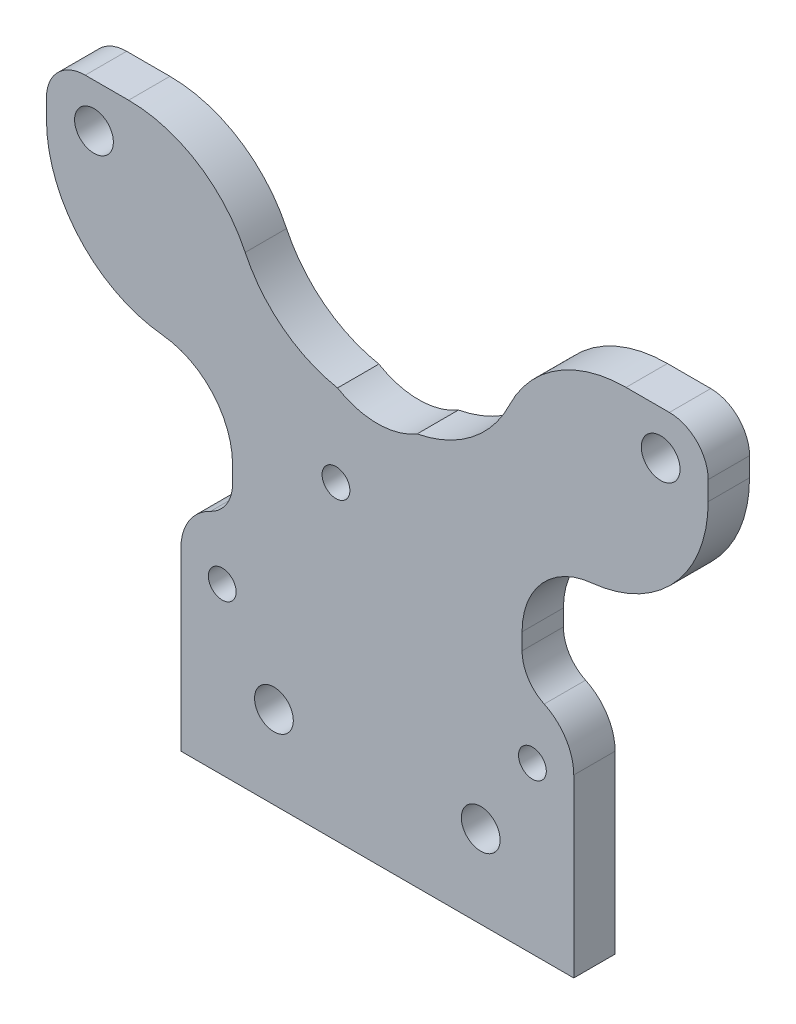
ISO-10303-21;
HEADER;
FILE_DESCRIPTION(('STEP AP214'),'2;1');
FILE_NAME('part.step','',(''),(''),'','','');
FILE_SCHEMA(('AUTOMOTIVE_DESIGN { 1 0 10303 214 1 1 1 1 }'));
ENDSEC;
DATA;
#1=APPLICATION_CONTEXT('core data for automotive mechanical design processes');
#2=APPLICATION_PROTOCOL_DEFINITION('international standard','automotive_design',2000,#1);
#3=PRODUCT_CONTEXT('',#1,'mechanical');
#4=PRODUCT('Part','Part','',(#3));
#5=PRODUCT_RELATED_PRODUCT_CATEGORY('part','',(#4));
#6=PRODUCT_DEFINITION_FORMATION('','',#4);
#7=PRODUCT_DEFINITION_CONTEXT('part definition',#1,'design');
#8=PRODUCT_DEFINITION('design','',#6,#7);
#9=PRODUCT_DEFINITION_SHAPE('','',#8);
#10=(LENGTH_UNIT() NAMED_UNIT(*) SI_UNIT(.MILLI.,.METRE.));
#11=(NAMED_UNIT(*) PLANE_ANGLE_UNIT() SI_UNIT($,.RADIAN.));
#12=(NAMED_UNIT(*) SI_UNIT($,.STERADIAN.) SOLID_ANGLE_UNIT());
#13=UNCERTAINTY_MEASURE_WITH_UNIT(LENGTH_MEASURE(1.E-05),#10,'distance_accuracy_value','');
#14=(GEOMETRIC_REPRESENTATION_CONTEXT(3) GLOBAL_UNCERTAINTY_ASSIGNED_CONTEXT((#13)) GLOBAL_UNIT_ASSIGNED_CONTEXT((#10,
#11,#12)) REPRESENTATION_CONTEXT('',''));
#15=CARTESIAN_POINT('',(0.,0.,0.));
#16=DIRECTION('',(0.,0.,1.));
#17=DIRECTION('',(1.,0.,0.));
#18=AXIS2_PLACEMENT_3D('',#15,#16,#17);
#19=CARTESIAN_POINT('',(0.,17.6,0.));
#20=DIRECTION('',(1.,0.,0.));
#21=DIRECTION('',(0.,0.,-1.));
#22=AXIS2_PLACEMENT_3D('',#19,#20,#21);
#23=PLANE('',#22);
#24=DIRECTION('',(0.,-1.,0.));
#25=VECTOR('',#24,1.);
#26=CARTESIAN_POINT('',(0.,17.6,3.2));
#27=LINE('',#26,#25);
#28=CARTESIAN_POINT('',(0.,13.6,3.2));
#29=VERTEX_POINT('',#28);
#30=CARTESIAN_POINT('',(0.,0.,3.2));
#31=VERTEX_POINT('',#30);
#32=EDGE_CURVE('E228',#29,#31,#27,.T.);
#33=ORIENTED_EDGE('',*,*,#32,.F.);
#34=DIRECTION('',(0.,0.,1.));
#35=VECTOR('',#34,1.);
#36=CARTESIAN_POINT('',(0.,13.6,0.));
#37=LINE('',#36,#35);
#38=CARTESIAN_POINT('',(0.,13.6,0.));
#39=VERTEX_POINT('',#38);
#40=EDGE_CURVE('E332',#29,#39,#37,.F.);
#41=ORIENTED_EDGE('',*,*,#40,.T.);
#42=DIRECTION('',(0.,-1.,0.));
#43=VECTOR('',#42,1.);
#44=CARTESIAN_POINT('',(0.,17.6,0.));
#45=LINE('',#44,#43);
#46=CARTESIAN_POINT('',(0.,0.,0.));
#47=VERTEX_POINT('',#46);
#48=EDGE_CURVE('E314',#39,#47,#45,.T.);
#49=ORIENTED_EDGE('',*,*,#48,.T.);
#50=DIRECTION('',(0.,0.,1.));
#51=VECTOR('',#50,1.);
#52=CARTESIAN_POINT('',(0.,0.,0.));
#53=LINE('',#52,#51);
#54=EDGE_CURVE('E302',#47,#31,#53,.T.);
#55=ORIENTED_EDGE('',*,*,#54,.T.);
#56=EDGE_LOOP('',(#33,#41,#49,#55));
#57=FACE_BOUND('',#56,.T.);
#58=ADVANCED_FACE('F45',(#57),#23,.F.);
#59=CARTESIAN_POINT('',(0.,17.6,3.2));
#60=DIRECTION('',(0.,0.,-1.));
#61=DIRECTION('',(-1.,0.,0.));
#62=AXIS2_PLACEMENT_3D('',#59,#60,#61);
#63=PLANE('',#62);
#64=CARTESIAN_POINT('',(37.125,38.2,3.2));
#65=DIRECTION('',(0.,0.,1.));
#66=DIRECTION('',(1.,0.,0.));
#67=AXIS2_PLACEMENT_3D('',#64,#65,#66);
#68=CIRCLE('',#67,1.5);
#69=CARTESIAN_POINT('',(38.625,38.2,3.2));
#70=VERTEX_POINT('',#69);
#71=EDGE_CURVE('E234',#70,#70,#68,.T.);
#72=ORIENTED_EDGE('',*,*,#71,.F.);
#73=EDGE_LOOP('',(#72));
#74=FACE_BOUND('',#73,.T.);
#75=CARTESIAN_POINT('',(-6.725,38.2,3.2));
#76=DIRECTION('',(0.,0.,1.));
#77=DIRECTION('',(1.,0.,0.));
#78=AXIS2_PLACEMENT_3D('',#75,#76,#77);
#79=CIRCLE('',#78,1.5);
#80=CARTESIAN_POINT('',(-5.225,38.2,3.2));
#81=VERTEX_POINT('',#80);
#82=EDGE_CURVE('E240',#81,#81,#79,.T.);
#83=ORIENTED_EDGE('',*,*,#82,.F.);
#84=EDGE_LOOP('',(#83));
#85=FACE_BOUND('',#84,.T.);
#86=CARTESIAN_POINT('',(12.,24.,3.2));
#87=DIRECTION('',(0.,0.,1.));
#88=DIRECTION('',(1.,0.,0.));
#89=AXIS2_PLACEMENT_3D('',#86,#87,#88);
#90=CIRCLE('',#89,1.075);
#91=CARTESIAN_POINT('',(13.075,24.,3.2));
#92=VERTEX_POINT('',#91);
#93=EDGE_CURVE('E265',#92,#92,#90,.T.);
#94=ORIENTED_EDGE('',*,*,#93,.F.);
#95=EDGE_LOOP('',(#94));
#96=FACE_BOUND('',#95,.T.);
#97=CARTESIAN_POINT('',(3.2,12.8,3.2));
#98=DIRECTION('',(0.,0.,-1.));
#99=DIRECTION('',(-1.,0.,0.));
#100=AXIS2_PLACEMENT_3D('',#97,#98,#99);
#101=CIRCLE('',#100,1.075);
#102=CARTESIAN_POINT('',(2.125,12.8,3.2));
#103=VERTEX_POINT('',#102);
#104=EDGE_CURVE('E285',#103,#103,#101,.T.);
#105=ORIENTED_EDGE('',*,*,#104,.T.);
#106=EDGE_LOOP('',(#105));
#107=FACE_BOUND('',#106,.T.);
#108=CARTESIAN_POINT('',(27.2,12.8,3.2));
#109=DIRECTION('',(0.,0.,-1.));
#110=DIRECTION('',(-1.,0.,0.));
#111=AXIS2_PLACEMENT_3D('',#108,#109,#110);
#112=CIRCLE('',#111,1.075);
#113=CARTESIAN_POINT('',(26.125,12.8,3.2));
#114=VERTEX_POINT('',#113);
#115=EDGE_CURVE('E291',#114,#114,#112,.T.);
#116=ORIENTED_EDGE('',*,*,#115,.T.);
#117=EDGE_LOOP('',(#116));
#118=FACE_BOUND('',#117,.T.);
#119=CARTESIAN_POINT('',(7.2,6.4,3.2));
#120=DIRECTION('',(0.,0.,1.));
#121=DIRECTION('',(1.,0.,0.));
#122=AXIS2_PLACEMENT_3D('',#119,#120,#121);
#123=CIRCLE('',#122,1.5);
#124=CARTESIAN_POINT('',(8.70000000000001,6.4,3.2));
#125=VERTEX_POINT('',#124);
#126=EDGE_CURVE('E294',#125,#125,#123,.T.);
#127=ORIENTED_EDGE('',*,*,#126,.F.);
#128=EDGE_LOOP('',(#127));
#129=FACE_BOUND('',#128,.T.);
#130=CARTESIAN_POINT('',(23.2,6.4,3.2));
#131=DIRECTION('',(0.,0.,1.));
#132=DIRECTION('',(1.,0.,0.));
#133=AXIS2_PLACEMENT_3D('',#130,#131,#132);
#134=CIRCLE('',#133,1.5);
#135=CARTESIAN_POINT('',(24.7,6.4,3.2));
#136=VERTEX_POINT('',#135);
#137=EDGE_CURVE('E298',#136,#136,#134,.T.);
#138=ORIENTED_EDGE('',*,*,#137,.F.);
#139=EDGE_LOOP('',(#138));
#140=FACE_BOUND('',#139,.T.);
#141=DIRECTION('',(-1.,0.,0.));
#142=VECTOR('',#141,1.);
#143=CARTESIAN_POINT('',(26.4,41.6,3.2));
#144=LINE('',#143,#142);
#145=CARTESIAN_POINT('',(37.8,41.6,3.2));
#146=VERTEX_POINT('',#145);
#147=CARTESIAN_POINT('',(34.4461267620821,41.6,3.2));
#148=VERTEX_POINT('',#147);
#149=EDGE_CURVE('E253',#146,#148,#144,.T.);
#150=ORIENTED_EDGE('',*,*,#149,.T.);
#151=CARTESIAN_POINT('',(34.4461267620821,31.6,3.2));
#152=DIRECTION('',(0.,0.,-1.));
#153=DIRECTION('',(-1.,0.,0.));
#154=AXIS2_PLACEMENT_3D('',#151,#152,#153);
#155=CIRCLE('',#154,10.);
#156=CARTESIAN_POINT('',(25.4230633810411,35.9109543284191,3.2));
#157=VERTEX_POINT('',#156);
#158=EDGE_CURVE('E404',#148,#157,#155,.F.);
#159=ORIENTED_EDGE('',*,*,#158,.T.);
#160=CARTESIAN_POINT('',(16.4,40.2219086568383,3.2));
#161=DIRECTION('',(0.,0.,-1.));
#162=DIRECTION('',(-1.,0.,0.));
#163=AXIS2_PLACEMENT_3D('',#160,#161,#162);
#164=CIRCLE('',#163,10.);
#165=CARTESIAN_POINT('',(18.2788587857328,30.4,3.2));
#166=VERTEX_POINT('',#165);
#167=EDGE_CURVE('E216',#157,#166,#164,.T.);
#168=ORIENTED_EDGE('',*,*,#167,.T.);
#169=CARTESIAN_POINT('',(15.2,35.5498183052916,3.2));
#170=DIRECTION('',(0.,0.,1.));
#171=DIRECTION('',(1.,0.,0.));
#172=AXIS2_PLACEMENT_3D('',#169,#170,#171);
#173=CIRCLE('',#172,6.);
#174=CARTESIAN_POINT('',(12.1211412142672,30.4,3.2));
#175=VERTEX_POINT('',#174);
#176=EDGE_CURVE('E223',#175,#166,#173,.T.);
#177=ORIENTED_EDGE('',*,*,#176,.F.);
#178=CARTESIAN_POINT('',(14.,40.2219086568383,3.2));
#179=DIRECTION('',(0.,0.,-1.));
#180=DIRECTION('',(-1.,0.,0.));
#181=AXIS2_PLACEMENT_3D('',#178,#179,#180);
#182=CIRCLE('',#181,10.);
#183=CARTESIAN_POINT('',(4.97693661895893,35.9109543284191,3.2));
#184=VERTEX_POINT('',#183);
#185=EDGE_CURVE('E206',#175,#184,#182,.T.);
#186=ORIENTED_EDGE('',*,*,#185,.T.);
#187=CARTESIAN_POINT('',(-4.04612676208213,31.6,3.2));
#188=DIRECTION('',(0.,0.,-1.));
#189=DIRECTION('',(-1.,0.,0.));
#190=AXIS2_PLACEMENT_3D('',#187,#188,#189);
#191=CIRCLE('',#190,10.);
#192=CARTESIAN_POINT('',(-4.04612676208213,41.6,3.2));
#193=VERTEX_POINT('',#192);
#194=EDGE_CURVE('E402',#184,#193,#191,.F.);
#195=ORIENTED_EDGE('',*,*,#194,.T.);
#196=DIRECTION('',(-1.,0.,0.));
#197=VECTOR('',#196,1.);
#198=CARTESIAN_POINT('',(4.,41.6,3.2));
#199=LINE('',#198,#197);
#200=CARTESIAN_POINT('',(-7.4,41.6,3.2));
#201=VERTEX_POINT('',#200);
#202=EDGE_CURVE('E256',#193,#201,#199,.T.);
#203=ORIENTED_EDGE('',*,*,#202,.T.);
#204=CARTESIAN_POINT('',(-7.4,38.6,3.2));
#205=DIRECTION('',(0.,0.,-1.));
#206=DIRECTION('',(-1.,0.,0.));
#207=AXIS2_PLACEMENT_3D('',#204,#205,#206);
#208=CIRCLE('',#207,3.);
#209=CARTESIAN_POINT('',(-10.4,38.6,3.2));
#210=VERTEX_POINT('',#209);
#211=EDGE_CURVE('E383',#201,#210,#208,.F.);
#212=ORIENTED_EDGE('',*,*,#211,.T.);
#213=DIRECTION('',(0.,-1.,0.));
#214=VECTOR('',#213,1.);
#215=CARTESIAN_POINT('',(-10.4,27.2,3.2));
#216=LINE('',#215,#214);
#217=CARTESIAN_POINT('',(-10.4,37.1197989937059,3.2));
#218=VERTEX_POINT('',#217);
#219=EDGE_CURVE('E263',#210,#218,#216,.T.);
#220=ORIENTED_EDGE('',*,*,#219,.T.);
#221=CARTESIAN_POINT('',(-0.399999999999999,37.1197989937059,3.2));
#222=DIRECTION('',(0.,0.,-1.));
#223=DIRECTION('',(-1.,0.,0.));
#224=AXIS2_PLACEMENT_3D('',#221,#222,#223);
#225=CIRCLE('',#224,10.);
#226=CARTESIAN_POINT('',(-1.4,27.1699246226397,3.2));
#227=VERTEX_POINT('',#226);
#228=EDGE_CURVE('E364',#218,#227,#225,.F.);
#229=ORIENTED_EDGE('',*,*,#228,.T.);
#230=CARTESIAN_POINT('',(-2.,21.2,3.2));
#231=DIRECTION('',(0.,0.,-1.));
#232=DIRECTION('',(-1.,0.,0.));
#233=AXIS2_PLACEMENT_3D('',#230,#231,#232);
#234=CIRCLE('',#233,6.);
#235=CARTESIAN_POINT('',(4.,21.2,3.2));
#236=VERTEX_POINT('',#235);
#237=EDGE_CURVE('E356',#227,#236,#234,.T.);
#238=ORIENTED_EDGE('',*,*,#237,.T.);
#239=DIRECTION('',(0.,-1.,0.));
#240=VECTOR('',#239,1.);
#241=CARTESIAN_POINT('',(4.,30.4,3.2));
#242=LINE('',#241,#240);
#243=CARTESIAN_POINT('',(4.,19.9245553203368,3.2));
#244=VERTEX_POINT('',#243);
#245=EDGE_CURVE('E279',#236,#244,#242,.T.);
#246=ORIENTED_EDGE('',*,*,#245,.T.);
#247=CARTESIAN_POINT('',(1.,19.9245553203368,3.2));
#248=DIRECTION('',(0.,0.,-1.));
#249=DIRECTION('',(-1.,0.,0.));
#250=AXIS2_PLACEMENT_3D('',#247,#248,#249);
#251=CIRCLE('',#250,3.);
#252=CARTESIAN_POINT('',(2.28571428571429,17.214031611621,3.2));
#253=VERTEX_POINT('',#252);
#254=EDGE_CURVE('E424',#244,#253,#251,.T.);
#255=ORIENTED_EDGE('',*,*,#254,.T.);
#256=CARTESIAN_POINT('',(4.,13.6,3.2));
#257=DIRECTION('',(0.,0.,-1.));
#258=DIRECTION('',(-1.,0.,0.));
#259=AXIS2_PLACEMENT_3D('',#256,#257,#258);
#260=CIRCLE('',#259,4.);
#261=EDGE_CURVE('E330',#253,#29,#260,.F.);
#262=ORIENTED_EDGE('',*,*,#261,.T.);
#263=ORIENTED_EDGE('',*,*,#32,.T.);
#264=DIRECTION('',(1.,0.,0.));
#265=VECTOR('',#264,1.);
#266=CARTESIAN_POINT('',(0.,0.,3.2));
#267=LINE('',#266,#265);
#268=CARTESIAN_POINT('',(30.4,0.,3.2));
#269=VERTEX_POINT('',#268);
#270=EDGE_CURVE('E305',#31,#269,#267,.T.);
#271=ORIENTED_EDGE('',*,*,#270,.T.);
#272=DIRECTION('',(0.,-1.,0.));
#273=VECTOR('',#272,1.);
#274=CARTESIAN_POINT('',(30.4,17.6,3.2));
#275=LINE('',#274,#273);
#276=CARTESIAN_POINT('',(30.4,13.6,3.2));
#277=VERTEX_POINT('',#276);
#278=EDGE_CURVE('E318',#277,#269,#275,.T.);
#279=ORIENTED_EDGE('',*,*,#278,.F.);
#280=CARTESIAN_POINT('',(26.4,13.6,3.2));
#281=DIRECTION('',(0.,0.,-1.));
#282=DIRECTION('',(-1.,0.,0.));
#283=AXIS2_PLACEMENT_3D('',#280,#281,#282);
#284=CIRCLE('',#283,4.);
#285=CARTESIAN_POINT('',(28.1142857142857,17.214031611621,3.2));
#286=VERTEX_POINT('',#285);
#287=EDGE_CURVE('E328',#277,#286,#284,.F.);
#288=ORIENTED_EDGE('',*,*,#287,.T.);
#289=CARTESIAN_POINT('',(29.4,19.9245553203368,3.2));
#290=DIRECTION('',(0.,0.,-1.));
#291=DIRECTION('',(-1.,0.,0.));
#292=AXIS2_PLACEMENT_3D('',#289,#290,#291);
#293=CIRCLE('',#292,3.);
#294=CARTESIAN_POINT('',(26.4,19.9245553203368,3.2));
#295=VERTEX_POINT('',#294);
#296=EDGE_CURVE('E13',#286,#295,#293,.T.);
#297=ORIENTED_EDGE('',*,*,#296,.T.);
#298=DIRECTION('',(0.,-1.,0.));
#299=VECTOR('',#298,1.);
#300=CARTESIAN_POINT('',(26.4,30.4,3.2));
#301=LINE('',#300,#299);
#302=CARTESIAN_POINT('',(26.4,21.2,3.2));
#303=VERTEX_POINT('',#302);
#304=EDGE_CURVE('E276',#303,#295,#301,.T.);
#305=ORIENTED_EDGE('',*,*,#304,.F.);
#306=CARTESIAN_POINT('',(32.4,21.2,3.2));
#307=DIRECTION('',(0.,0.,-1.));
#308=DIRECTION('',(-1.,0.,0.));
#309=AXIS2_PLACEMENT_3D('',#306,#307,#308);
#310=CIRCLE('',#309,6.);
#311=CARTESIAN_POINT('',(31.8,27.1699246226397,3.2));
#312=VERTEX_POINT('',#311);
#313=EDGE_CURVE('E351',#303,#312,#310,.T.);
#314=ORIENTED_EDGE('',*,*,#313,.T.);
#315=CARTESIAN_POINT('',(30.8,37.1197989937059,3.2));
#316=DIRECTION('',(0.,0.,-1.));
#317=DIRECTION('',(-1.,0.,0.));
#318=AXIS2_PLACEMENT_3D('',#315,#316,#317);
#319=CIRCLE('',#318,10.);
#320=CARTESIAN_POINT('',(40.8,37.1197989937059,3.2));
#321=VERTEX_POINT('',#320);
#322=EDGE_CURVE('E366',#312,#321,#319,.F.);
#323=ORIENTED_EDGE('',*,*,#322,.T.);
#324=DIRECTION('',(0.,1.,0.));
#325=VECTOR('',#324,1.);
#326=CARTESIAN_POINT('',(40.8,27.2,3.2));
#327=LINE('',#326,#325);
#328=CARTESIAN_POINT('',(40.8,38.6,3.2));
#329=VERTEX_POINT('',#328);
#330=EDGE_CURVE('E246',#321,#329,#327,.T.);
#331=ORIENTED_EDGE('',*,*,#330,.T.);
#332=CARTESIAN_POINT('',(37.8,38.6,3.2));
#333=DIRECTION('',(0.,0.,-1.));
#334=DIRECTION('',(-1.,0.,0.));
#335=AXIS2_PLACEMENT_3D('',#332,#333,#334);
#336=CIRCLE('',#335,3.);
#337=EDGE_CURVE('E385',#329,#146,#336,.F.);
#338=ORIENTED_EDGE('',*,*,#337,.T.);
#339=EDGE_LOOP('',(#150,#159,#168,#177,#186,#195,#203,#212,#220,#229,#238,#246,#255,#262,#263,
#271,#279,#288,#297,#305,#314,#323,#331,#338));
#340=FACE_BOUND('',#339,.T.);
#341=ADVANCED_FACE('F231',(#74,#85,#96,#107,#118,#129,#140,#340),#63,.F.);
#342=CARTESIAN_POINT('',(30.4,17.6,0.));
#343=DIRECTION('',(-1.,0.,0.));
#344=DIRECTION('',(0.,0.,1.));
#345=AXIS2_PLACEMENT_3D('',#342,#343,#344);
#346=PLANE('',#345);
#347=DIRECTION('',(0.,-1.,0.));
#348=VECTOR('',#347,1.);
#349=CARTESIAN_POINT('',(30.4,17.6,0.));
#350=LINE('',#349,#348);
#351=CARTESIAN_POINT('',(30.4,13.6,0.));
#352=VERTEX_POINT('',#351);
#353=CARTESIAN_POINT('',(30.4,0.,0.));
#354=VERTEX_POINT('',#353);
#355=EDGE_CURVE('E316',#352,#354,#350,.T.);
#356=ORIENTED_EDGE('',*,*,#355,.F.);
#357=DIRECTION('',(0.,0.,-1.));
#358=VECTOR('',#357,1.);
#359=CARTESIAN_POINT('',(30.4,13.6,3.2));
#360=LINE('',#359,#358);
#361=EDGE_CURVE('E339',#352,#277,#360,.F.);
#362=ORIENTED_EDGE('',*,*,#361,.T.);
#363=ORIENTED_EDGE('',*,*,#278,.T.);
#364=DIRECTION('',(0.,0.,-1.));
#365=VECTOR('',#364,1.);
#366=CARTESIAN_POINT('',(30.4,0.,0.));
#367=LINE('',#366,#365);
#368=EDGE_CURVE('E308',#269,#354,#367,.T.);
#369=ORIENTED_EDGE('',*,*,#368,.T.);
#370=EDGE_LOOP('',(#356,#362,#363,#369));
#371=FACE_BOUND('',#370,.T.);
#372=ADVANCED_FACE('F459',(#371),#346,.F.);
#373=CARTESIAN_POINT('',(0.,17.6,0.));
#374=DIRECTION('',(0.,0.,1.));
#375=DIRECTION('',(1.,0.,0.));
#376=AXIS2_PLACEMENT_3D('',#373,#374,#375);
#377=PLANE('',#376);
#378=CARTESIAN_POINT('',(37.125,38.2,0.));
#379=DIRECTION('',(0.,0.,1.));
#380=DIRECTION('',(1.,0.,0.));
#381=AXIS2_PLACEMENT_3D('',#378,#379,#380);
#382=CIRCLE('',#381,1.5);
#383=CARTESIAN_POINT('',(38.625,38.2,0.));
#384=VERTEX_POINT('',#383);
#385=EDGE_CURVE('E237',#384,#384,#382,.T.);
#386=ORIENTED_EDGE('',*,*,#385,.T.);
#387=EDGE_LOOP('',(#386));
#388=FACE_BOUND('',#387,.T.);
#389=CARTESIAN_POINT('',(-6.725,38.2,0.));
#390=DIRECTION('',(0.,0.,1.));
#391=DIRECTION('',(1.,0.,0.));
#392=AXIS2_PLACEMENT_3D('',#389,#390,#391);
#393=CIRCLE('',#392,1.5);
#394=CARTESIAN_POINT('',(-5.225,38.2,0.));
#395=VERTEX_POINT('',#394);
#396=EDGE_CURVE('E243',#395,#395,#393,.T.);
#397=ORIENTED_EDGE('',*,*,#396,.T.);
#398=EDGE_LOOP('',(#397));
#399=FACE_BOUND('',#398,.T.);
#400=CARTESIAN_POINT('',(12.,24.,0.));
#401=DIRECTION('',(0.,0.,1.));
#402=DIRECTION('',(1.,0.,0.));
#403=AXIS2_PLACEMENT_3D('',#400,#401,#402);
#404=CIRCLE('',#403,1.075);
#405=CARTESIAN_POINT('',(13.075,24.,0.));
#406=VERTEX_POINT('',#405);
#407=EDGE_CURVE('E270',#406,#406,#404,.T.);
#408=ORIENTED_EDGE('',*,*,#407,.T.);
#409=EDGE_LOOP('',(#408));
#410=FACE_BOUND('',#409,.T.);
#411=CARTESIAN_POINT('',(3.2,12.8,0.));
#412=DIRECTION('',(0.,0.,-1.));
#413=DIRECTION('',(-1.,0.,0.));
#414=AXIS2_PLACEMENT_3D('',#411,#412,#413);
#415=CIRCLE('',#414,1.075);
#416=CARTESIAN_POINT('',(2.125,12.8,0.));
#417=VERTEX_POINT('',#416);
#418=EDGE_CURVE('E282',#417,#417,#415,.T.);
#419=ORIENTED_EDGE('',*,*,#418,.F.);
#420=EDGE_LOOP('',(#419));
#421=FACE_BOUND('',#420,.T.);
#422=CARTESIAN_POINT('',(27.2,12.8,0.));
#423=DIRECTION('',(0.,0.,-1.));
#424=DIRECTION('',(-1.,0.,0.));
#425=AXIS2_PLACEMENT_3D('',#422,#423,#424);
#426=CIRCLE('',#425,1.075);
#427=CARTESIAN_POINT('',(26.125,12.8,0.));
#428=VERTEX_POINT('',#427);
#429=EDGE_CURVE('E288',#428,#428,#426,.T.);
#430=ORIENTED_EDGE('',*,*,#429,.F.);
#431=EDGE_LOOP('',(#430));
#432=FACE_BOUND('',#431,.T.);
#433=CARTESIAN_POINT('',(7.2,6.4,0.));
#434=DIRECTION('',(0.,0.,1.));
#435=DIRECTION('',(1.,0.,0.));
#436=AXIS2_PLACEMENT_3D('',#433,#434,#435);
#437=CIRCLE('',#436,1.5);
#438=CARTESIAN_POINT('',(8.70000000000001,6.4,0.));
#439=VERTEX_POINT('',#438);
#440=EDGE_CURVE('E297',#439,#439,#437,.T.);
#441=ORIENTED_EDGE('',*,*,#440,.T.);
#442=EDGE_LOOP('',(#441));
#443=FACE_BOUND('',#442,.T.);
#444=CARTESIAN_POINT('',(23.2,6.4,0.));
#445=DIRECTION('',(0.,0.,1.));
#446=DIRECTION('',(1.,0.,0.));
#447=AXIS2_PLACEMENT_3D('',#444,#445,#446);
#448=CIRCLE('',#447,1.5);
#449=CARTESIAN_POINT('',(24.7,6.4,0.));
#450=VERTEX_POINT('',#449);
#451=EDGE_CURVE('E301',#450,#450,#448,.T.);
#452=ORIENTED_EDGE('',*,*,#451,.T.);
#453=EDGE_LOOP('',(#452));
#454=FACE_BOUND('',#453,.T.);
#455=CARTESIAN_POINT('',(16.4,40.2219086568383,0.));
#456=DIRECTION('',(0.,0.,1.));
#457=DIRECTION('',(1.,0.,0.));
#458=AXIS2_PLACEMENT_3D('',#455,#456,#457);
#459=CIRCLE('',#458,10.);
#460=CARTESIAN_POINT('',(18.2788587857328,30.4,0.));
#461=VERTEX_POINT('',#460);
#462=CARTESIAN_POINT('',(25.4230633810411,35.9109543284191,0.));
#463=VERTEX_POINT('',#462);
#464=EDGE_CURVE('E341',#461,#463,#459,.T.);
#465=ORIENTED_EDGE('',*,*,#464,.T.);
#466=CARTESIAN_POINT('',(34.4461267620821,31.6,0.));
#467=DIRECTION('',(0.,0.,1.));
#468=DIRECTION('',(1.,0.,0.));
#469=AXIS2_PLACEMENT_3D('',#466,#467,#468);
#470=CIRCLE('',#469,10.);
#471=CARTESIAN_POINT('',(34.4461267620821,41.6,0.));
#472=VERTEX_POINT('',#471);
#473=EDGE_CURVE('E410',#463,#472,#470,.F.);
#474=ORIENTED_EDGE('',*,*,#473,.T.);
#475=DIRECTION('',(-1.,0.,0.));
#476=VECTOR('',#475,1.);
#477=CARTESIAN_POINT('',(26.4,41.6,0.));
#478=LINE('',#477,#476);
#479=CARTESIAN_POINT('',(37.8,41.6,0.));
#480=VERTEX_POINT('',#479);
#481=EDGE_CURVE('E252',#480,#472,#478,.T.);
#482=ORIENTED_EDGE('',*,*,#481,.F.);
#483=CARTESIAN_POINT('',(37.8,38.6,0.));
#484=DIRECTION('',(0.,0.,1.));
#485=DIRECTION('',(1.,0.,0.));
#486=AXIS2_PLACEMENT_3D('',#483,#484,#485);
#487=CIRCLE('',#486,3.);
#488=CARTESIAN_POINT('',(40.8,38.6,0.));
#489=VERTEX_POINT('',#488);
#490=EDGE_CURVE('E392',#480,#489,#487,.F.);
#491=ORIENTED_EDGE('',*,*,#490,.T.);
#492=DIRECTION('',(0.,1.,0.));
#493=VECTOR('',#492,1.);
#494=CARTESIAN_POINT('',(40.8,27.2,0.));
#495=LINE('',#494,#493);
#496=CARTESIAN_POINT('',(40.8,37.1197989937059,0.));
#497=VERTEX_POINT('',#496);
#498=EDGE_CURVE('E249',#497,#489,#495,.T.);
#499=ORIENTED_EDGE('',*,*,#498,.F.);
#500=CARTESIAN_POINT('',(30.8,37.1197989937059,0.));
#501=DIRECTION('',(0.,0.,1.));
#502=DIRECTION('',(1.,0.,0.));
#503=AXIS2_PLACEMENT_3D('',#500,#501,#502);
#504=CIRCLE('',#503,10.);
#505=CARTESIAN_POINT('',(31.8,27.1699246226397,0.));
#506=VERTEX_POINT('',#505);
#507=EDGE_CURVE('E373',#497,#506,#504,.F.);
#508=ORIENTED_EDGE('',*,*,#507,.T.);
#509=CARTESIAN_POINT('',(32.4,21.2,0.));
#510=DIRECTION('',(0.,0.,1.));
#511=DIRECTION('',(1.,0.,0.));
#512=AXIS2_PLACEMENT_3D('',#509,#510,#511);
#513=CIRCLE('',#512,6.);
#514=CARTESIAN_POINT('',(26.4,21.2,0.));
#515=VERTEX_POINT('',#514);
#516=EDGE_CURVE('E354',#506,#515,#513,.T.);
#517=ORIENTED_EDGE('',*,*,#516,.T.);
#518=DIRECTION('',(0.,-1.,0.));
#519=VECTOR('',#518,1.);
#520=CARTESIAN_POINT('',(26.4,30.4,0.));
#521=LINE('',#520,#519);
#522=CARTESIAN_POINT('',(26.4,19.9245553203368,0.));
#523=VERTEX_POINT('',#522);
#524=EDGE_CURVE('E274',#515,#523,#521,.T.);
#525=ORIENTED_EDGE('',*,*,#524,.T.);
#526=CARTESIAN_POINT('',(29.4,19.9245553203368,0.));
#527=DIRECTION('',(0.,0.,1.));
#528=DIRECTION('',(1.,0.,0.));
#529=AXIS2_PLACEMENT_3D('',#526,#527,#528);
#530=CIRCLE('',#529,3.);
#531=CARTESIAN_POINT('',(28.1142857142857,17.214031611621,0.));
#532=VERTEX_POINT('',#531);
#533=EDGE_CURVE('E53',#523,#532,#530,.T.);
#534=ORIENTED_EDGE('',*,*,#533,.T.);
#535=CARTESIAN_POINT('',(26.4,13.6,0.));
#536=DIRECTION('',(0.,0.,1.));
#537=DIRECTION('',(1.,0.,0.));
#538=AXIS2_PLACEMENT_3D('',#535,#536,#537);
#539=CIRCLE('',#538,4.);
#540=EDGE_CURVE('E334',#532,#352,#539,.F.);
#541=ORIENTED_EDGE('',*,*,#540,.T.);
#542=ORIENTED_EDGE('',*,*,#355,.T.);
#543=DIRECTION('',(-1.,0.,0.));
#544=VECTOR('',#543,1.);
#545=CARTESIAN_POINT('',(0.,0.,0.));
#546=LINE('',#545,#544);
#547=EDGE_CURVE('E311',#354,#47,#546,.T.);
#548=ORIENTED_EDGE('',*,*,#547,.T.);
#549=ORIENTED_EDGE('',*,*,#48,.F.);
#550=CARTESIAN_POINT('',(4.,13.6,0.));
#551=DIRECTION('',(0.,0.,1.));
#552=DIRECTION('',(1.,0.,0.));
#553=AXIS2_PLACEMENT_3D('',#550,#551,#552);
#554=CIRCLE('',#553,4.);
#555=CARTESIAN_POINT('',(2.28571428571429,17.214031611621,0.));
#556=VERTEX_POINT('',#555);
#557=EDGE_CURVE('E336',#39,#556,#554,.F.);
#558=ORIENTED_EDGE('',*,*,#557,.T.);
#559=CARTESIAN_POINT('',(1.,19.9245553203368,0.));
#560=DIRECTION('',(0.,0.,1.));
#561=DIRECTION('',(1.,0.,0.));
#562=AXIS2_PLACEMENT_3D('',#559,#560,#561);
#563=CIRCLE('',#562,3.);
#564=CARTESIAN_POINT('',(4.,19.9245553203368,0.));
#565=VERTEX_POINT('',#564);
#566=EDGE_CURVE('E426',#556,#565,#563,.T.);
#567=ORIENTED_EDGE('',*,*,#566,.T.);
#568=DIRECTION('',(0.,-1.,0.));
#569=VECTOR('',#568,1.);
#570=CARTESIAN_POINT('',(4.,30.4,0.));
#571=LINE('',#570,#569);
#572=CARTESIAN_POINT('',(4.,21.2,0.));
#573=VERTEX_POINT('',#572);
#574=EDGE_CURVE('E271',#573,#565,#571,.T.);
#575=ORIENTED_EDGE('',*,*,#574,.F.);
#576=CARTESIAN_POINT('',(-2.,21.2,0.));
#577=DIRECTION('',(0.,0.,1.));
#578=DIRECTION('',(1.,0.,0.));
#579=AXIS2_PLACEMENT_3D('',#576,#577,#578);
#580=CIRCLE('',#579,6.);
#581=CARTESIAN_POINT('',(-1.4,27.1699246226397,0.));
#582=VERTEX_POINT('',#581);
#583=EDGE_CURVE('E358',#573,#582,#580,.T.);
#584=ORIENTED_EDGE('',*,*,#583,.T.);
#585=CARTESIAN_POINT('',(-0.399999999999999,37.1197989937059,0.));
#586=DIRECTION('',(0.,0.,1.));
#587=DIRECTION('',(1.,0.,0.));
#588=AXIS2_PLACEMENT_3D('',#585,#586,#587);
#589=CIRCLE('',#588,10.);
#590=CARTESIAN_POINT('',(-10.4,37.1197989937059,0.));
#591=VERTEX_POINT('',#590);
#592=EDGE_CURVE('E370',#582,#591,#589,.F.);
#593=ORIENTED_EDGE('',*,*,#592,.T.);
#594=DIRECTION('',(0.,-1.,0.));
#595=VECTOR('',#594,1.);
#596=CARTESIAN_POINT('',(-10.4,27.2,0.));
#597=LINE('',#596,#595);
#598=CARTESIAN_POINT('',(-10.4,38.6,0.));
#599=VERTEX_POINT('',#598);
#600=EDGE_CURVE('E262',#599,#591,#597,.T.);
#601=ORIENTED_EDGE('',*,*,#600,.F.);
#602=CARTESIAN_POINT('',(-7.4,38.6,0.));
#603=DIRECTION('',(0.,0.,1.));
#604=DIRECTION('',(1.,0.,0.));
#605=AXIS2_PLACEMENT_3D('',#602,#603,#604);
#606=CIRCLE('',#605,3.);
#607=CARTESIAN_POINT('',(-7.4,41.6,0.));
#608=VERTEX_POINT('',#607);
#609=EDGE_CURVE('E389',#599,#608,#606,.F.);
#610=ORIENTED_EDGE('',*,*,#609,.T.);
#611=DIRECTION('',(-1.,0.,0.));
#612=VECTOR('',#611,1.);
#613=CARTESIAN_POINT('',(4.,41.6,0.));
#614=LINE('',#613,#612);
#615=CARTESIAN_POINT('',(-4.04612676208213,41.6,0.));
#616=VERTEX_POINT('',#615);
#617=EDGE_CURVE('E260',#616,#608,#614,.T.);
#618=ORIENTED_EDGE('',*,*,#617,.F.);
#619=CARTESIAN_POINT('',(-4.04612676208213,31.6,0.));
#620=DIRECTION('',(0.,0.,1.));
#621=DIRECTION('',(1.,0.,0.));
#622=AXIS2_PLACEMENT_3D('',#619,#620,#621);
#623=CIRCLE('',#622,10.);
#624=CARTESIAN_POINT('',(4.97693661895893,35.9109543284191,0.));
#625=VERTEX_POINT('',#624);
#626=EDGE_CURVE('E408',#616,#625,#623,.F.);
#627=ORIENTED_EDGE('',*,*,#626,.T.);
#628=CARTESIAN_POINT('',(14.,40.2219086568383,0.));
#629=DIRECTION('',(0.,0.,1.));
#630=DIRECTION('',(1.,0.,0.));
#631=AXIS2_PLACEMENT_3D('',#628,#629,#630);
#632=CIRCLE('',#631,10.);
#633=CARTESIAN_POINT('',(12.1211412142672,30.4,0.));
#634=VERTEX_POINT('',#633);
#635=EDGE_CURVE('E215',#625,#634,#632,.T.);
#636=ORIENTED_EDGE('',*,*,#635,.T.);
#637=CARTESIAN_POINT('',(15.2,35.5498183052916,0.));
#638=DIRECTION('',(0.,0.,1.));
#639=DIRECTION('',(1.,0.,0.));
#640=AXIS2_PLACEMENT_3D('',#637,#638,#639);
#641=CIRCLE('',#640,6.);
#642=EDGE_CURVE('E226',#634,#461,#641,.T.);
#643=ORIENTED_EDGE('',*,*,#642,.T.);
#644=EDGE_LOOP('',(#465,#474,#482,#491,#499,#508,#517,#525,#534,#541,#542,#548,#549,#558,#567,
#575,#584,#593,#601,#610,#618,#627,#636,#643));
#645=FACE_BOUND('',#644,.T.);
#646=ADVANCED_FACE('F429',(#388,#399,#410,#421,#432,#443,#454,#645),#377,.F.);
#647=CARTESIAN_POINT('',(0.,0.,0.));
#648=DIRECTION('',(0.,1.,0.));
#649=DIRECTION('',(0.,0.,1.));
#650=AXIS2_PLACEMENT_3D('',#647,#648,#649);
#651=PLANE('',#650);
#652=ORIENTED_EDGE('',*,*,#54,.F.);
#653=ORIENTED_EDGE('',*,*,#547,.F.);
#654=ORIENTED_EDGE('',*,*,#368,.F.);
#655=ORIENTED_EDGE('',*,*,#270,.F.);
#656=EDGE_LOOP('',(#652,#653,#654,#655));
#657=FACE_BOUND('',#656,.T.);
#658=ADVANCED_FACE('F453',(#657),#651,.F.);
#659=CARTESIAN_POINT('',(23.2,6.4,-12.8));
#660=DIRECTION('',(0.,0.,1.));
#661=DIRECTION('',(1.,0.,0.));
#662=AXIS2_PLACEMENT_3D('',#659,#660,#661);
#663=CYLINDRICAL_SURFACE('',#662,1.5);
#664=ORIENTED_EDGE('',*,*,#137,.T.);
#665=EDGE_LOOP('',(#664));
#666=FACE_BOUND('',#665,.T.);
#667=ORIENTED_EDGE('',*,*,#451,.F.);
#668=EDGE_LOOP('',(#667));
#669=FACE_BOUND('',#668,.T.);
#670=ADVANCED_FACE('F594',(#666,#669),#663,.F.);
#671=CARTESIAN_POINT('',(7.2,6.4,-12.8));
#672=DIRECTION('',(0.,0.,1.));
#673=DIRECTION('',(1.,0.,0.));
#674=AXIS2_PLACEMENT_3D('',#671,#672,#673);
#675=CYLINDRICAL_SURFACE('',#674,1.5);
#676=ORIENTED_EDGE('',*,*,#126,.T.);
#677=EDGE_LOOP('',(#676));
#678=FACE_BOUND('',#677,.T.);
#679=ORIENTED_EDGE('',*,*,#440,.F.);
#680=EDGE_LOOP('',(#679));
#681=FACE_BOUND('',#680,.T.);
#682=ADVANCED_FACE('F590',(#678,#681),#675,.F.);
#683=CARTESIAN_POINT('',(27.2,12.8,16.));
#684=DIRECTION('',(0.,0.,-1.));
#685=DIRECTION('',(-1.,0.,0.));
#686=AXIS2_PLACEMENT_3D('',#683,#684,#685);
#687=CYLINDRICAL_SURFACE('',#686,1.075);
#688=ORIENTED_EDGE('',*,*,#429,.T.);
#689=EDGE_LOOP('',(#688));
#690=FACE_BOUND('',#689,.T.);
#691=ORIENTED_EDGE('',*,*,#115,.F.);
#692=EDGE_LOOP('',(#691));
#693=FACE_BOUND('',#692,.T.);
#694=ADVANCED_FACE('F586',(#690,#693),#687,.F.);
#695=CARTESIAN_POINT('',(3.2,12.8,16.));
#696=DIRECTION('',(0.,0.,-1.));
#697=DIRECTION('',(-1.,0.,0.));
#698=AXIS2_PLACEMENT_3D('',#695,#696,#697);
#699=CYLINDRICAL_SURFACE('',#698,1.075);
#700=ORIENTED_EDGE('',*,*,#418,.T.);
#701=EDGE_LOOP('',(#700));
#702=FACE_BOUND('',#701,.T.);
#703=ORIENTED_EDGE('',*,*,#104,.F.);
#704=EDGE_LOOP('',(#703));
#705=FACE_BOUND('',#704,.T.);
#706=ADVANCED_FACE('F583',(#702,#705),#699,.F.);
#707=CARTESIAN_POINT('',(4.,30.4,3.2));
#708=DIRECTION('',(1.,0.,0.));
#709=DIRECTION('',(0.,0.,-1.));
#710=AXIS2_PLACEMENT_3D('',#707,#708,#709);
#711=PLANE('',#710);
#712=ORIENTED_EDGE('',*,*,#574,.T.);
#713=DIRECTION('',(0.,0.,-1.));
#714=VECTOR('',#713,1.);
#715=CARTESIAN_POINT('',(4.,19.9245553203368,3.2));
#716=LINE('',#715,#714);
#717=EDGE_CURVE('E415',#565,#244,#716,.F.);
#718=ORIENTED_EDGE('',*,*,#717,.T.);
#719=ORIENTED_EDGE('',*,*,#245,.F.);
#720=DIRECTION('',(0.,0.,1.));
#721=VECTOR('',#720,1.);
#722=CARTESIAN_POINT('',(4.,21.2,3.2));
#723=LINE('',#722,#721);
#724=EDGE_CURVE('E349',#236,#573,#723,.F.);
#725=ORIENTED_EDGE('',*,*,#724,.T.);
#726=EDGE_LOOP('',(#712,#718,#719,#725));
#727=FACE_BOUND('',#726,.T.);
#728=ADVANCED_FACE('F437',(#727),#711,.F.);
#729=CARTESIAN_POINT('',(26.4,30.4,3.2));
#730=DIRECTION('',(-1.,0.,0.));
#731=DIRECTION('',(0.,0.,1.));
#732=AXIS2_PLACEMENT_3D('',#729,#730,#731);
#733=PLANE('',#732);
#734=ORIENTED_EDGE('',*,*,#304,.T.);
#735=DIRECTION('',(0.,0.,1.));
#736=VECTOR('',#735,1.);
#737=CARTESIAN_POINT('',(26.4,19.9245553203368,3.2));
#738=LINE('',#737,#736);
#739=EDGE_CURVE('E420',#295,#523,#738,.F.);
#740=ORIENTED_EDGE('',*,*,#739,.T.);
#741=ORIENTED_EDGE('',*,*,#524,.F.);
#742=DIRECTION('',(0.,0.,1.));
#743=VECTOR('',#742,1.);
#744=CARTESIAN_POINT('',(26.4,21.2,3.2));
#745=LINE('',#744,#743);
#746=EDGE_CURVE('E346',#515,#303,#745,.T.);
#747=ORIENTED_EDGE('',*,*,#746,.T.);
#748=EDGE_LOOP('',(#734,#740,#741,#747));
#749=FACE_BOUND('',#748,.T.);
#750=ADVANCED_FACE('F526',(#749),#733,.F.);
#751=CARTESIAN_POINT('',(12.,24.,-12.8));
#752=DIRECTION('',(0.,0.,1.));
#753=DIRECTION('',(1.,0.,0.));
#754=AXIS2_PLACEMENT_3D('',#751,#752,#753);
#755=CYLINDRICAL_SURFACE('',#754,1.075);
#756=ORIENTED_EDGE('',*,*,#93,.T.);
#757=EDGE_LOOP('',(#756));
#758=FACE_BOUND('',#757,.T.);
#759=ORIENTED_EDGE('',*,*,#407,.F.);
#760=EDGE_LOOP('',(#759));
#761=FACE_BOUND('',#760,.T.);
#762=ADVANCED_FACE('F567',(#758,#761),#755,.F.);
#763=CARTESIAN_POINT('',(-10.4,27.2,0.));
#764=DIRECTION('',(-1.,0.,0.));
#765=DIRECTION('',(0.,0.,1.));
#766=AXIS2_PLACEMENT_3D('',#763,#764,#765);
#767=PLANE('',#766);
#768=ORIENTED_EDGE('',*,*,#219,.F.);
#769=DIRECTION('',(0.,0.,1.));
#770=VECTOR('',#769,1.);
#771=CARTESIAN_POINT('',(-10.4,38.6,0.));
#772=LINE('',#771,#770);
#773=EDGE_CURVE('E397',#210,#599,#772,.F.);
#774=ORIENTED_EDGE('',*,*,#773,.T.);
#775=ORIENTED_EDGE('',*,*,#600,.T.);
#776=DIRECTION('',(0.,0.,-1.));
#777=VECTOR('',#776,1.);
#778=CARTESIAN_POINT('',(-10.4,37.1197989937059,3.2));
#779=LINE('',#778,#777);
#780=EDGE_CURVE('E375',#591,#218,#779,.F.);
#781=ORIENTED_EDGE('',*,*,#780,.T.);
#782=EDGE_LOOP('',(#768,#774,#775,#781));
#783=FACE_BOUND('',#782,.T.);
#784=ADVANCED_FACE('F560',(#783),#767,.T.);
#785=CARTESIAN_POINT('',(4.,41.6,0.));
#786=DIRECTION('',(0.,1.,0.));
#787=DIRECTION('',(0.,0.,1.));
#788=AXIS2_PLACEMENT_3D('',#785,#786,#787);
#789=PLANE('',#788);
#790=ORIENTED_EDGE('',*,*,#202,.F.);
#791=DIRECTION('',(0.,0.,-1.));
#792=VECTOR('',#791,1.);
#793=CARTESIAN_POINT('',(-4.04612676208213,41.6,0.));
#794=LINE('',#793,#792);
#795=EDGE_CURVE('E413',#193,#616,#794,.T.);
#796=ORIENTED_EDGE('',*,*,#795,.T.);
#797=ORIENTED_EDGE('',*,*,#617,.T.);
#798=DIRECTION('',(0.,0.,1.));
#799=VECTOR('',#798,1.);
#800=CARTESIAN_POINT('',(-7.4,41.6,0.));
#801=LINE('',#800,#799);
#802=EDGE_CURVE('E394',#608,#201,#801,.T.);
#803=ORIENTED_EDGE('',*,*,#802,.T.);
#804=EDGE_LOOP('',(#790,#796,#797,#803));
#805=FACE_BOUND('',#804,.T.);
#806=ADVANCED_FACE('F553',(#805),#789,.T.);
#807=CARTESIAN_POINT('',(26.4,41.6,0.));
#808=DIRECTION('',(0.,1.,0.));
#809=DIRECTION('',(-1.,0.,0.));
#810=AXIS2_PLACEMENT_3D('',#807,#808,#809);
#811=PLANE('',#810);
#812=ORIENTED_EDGE('',*,*,#481,.T.);
#813=DIRECTION('',(0.,0.,-1.));
#814=VECTOR('',#813,1.);
#815=CARTESIAN_POINT('',(34.4461267620821,41.6,3.2));
#816=LINE('',#815,#814);
#817=EDGE_CURVE('E399',#472,#148,#816,.F.);
#818=ORIENTED_EDGE('',*,*,#817,.T.);
#819=ORIENTED_EDGE('',*,*,#149,.F.);
#820=DIRECTION('',(0.,0.,1.));
#821=VECTOR('',#820,1.);
#822=CARTESIAN_POINT('',(37.8,41.6,0.));
#823=LINE('',#822,#821);
#824=EDGE_CURVE('E387',#146,#480,#823,.F.);
#825=ORIENTED_EDGE('',*,*,#824,.T.);
#826=EDGE_LOOP('',(#812,#818,#819,#825));
#827=FACE_BOUND('',#826,.T.);
#828=ADVANCED_FACE('F543',(#827),#811,.T.);
#829=CARTESIAN_POINT('',(40.8,27.2,0.));
#830=DIRECTION('',(1.,0.,0.));
#831=DIRECTION('',(0.,0.,-1.));
#832=AXIS2_PLACEMENT_3D('',#829,#830,#831);
#833=PLANE('',#832);
#834=ORIENTED_EDGE('',*,*,#498,.T.);
#835=DIRECTION('',(0.,0.,1.));
#836=VECTOR('',#835,1.);
#837=CARTESIAN_POINT('',(40.8,38.6,0.));
#838=LINE('',#837,#836);
#839=EDGE_CURVE('E380',#489,#329,#838,.T.);
#840=ORIENTED_EDGE('',*,*,#839,.T.);
#841=ORIENTED_EDGE('',*,*,#330,.F.);
#842=DIRECTION('',(0.,0.,-1.));
#843=VECTOR('',#842,1.);
#844=CARTESIAN_POINT('',(40.8,37.1197989937059,0.));
#845=LINE('',#844,#843);
#846=EDGE_CURVE('E368',#321,#497,#845,.T.);
#847=ORIENTED_EDGE('',*,*,#846,.T.);
#848=EDGE_LOOP('',(#834,#840,#841,#847));
#849=FACE_BOUND('',#848,.T.);
#850=ADVANCED_FACE('F534',(#849),#833,.T.);
#851=CARTESIAN_POINT('',(-6.725,38.2,0.));
#852=DIRECTION('',(0.,0.,1.));
#853=DIRECTION('',(1.,0.,0.));
#854=AXIS2_PLACEMENT_3D('',#851,#852,#853);
#855=CYLINDRICAL_SURFACE('',#854,1.5);
#856=ORIENTED_EDGE('',*,*,#396,.F.);
#857=EDGE_LOOP('',(#856));
#858=FACE_BOUND('',#857,.T.);
#859=ORIENTED_EDGE('',*,*,#82,.T.);
#860=EDGE_LOOP('',(#859));
#861=FACE_BOUND('',#860,.T.);
#862=ADVANCED_FACE('F639',(#858,#861),#855,.F.);
#863=CARTESIAN_POINT('',(37.125,38.2,0.));
#864=DIRECTION('',(0.,0.,1.));
#865=DIRECTION('',(1.,0.,0.));
#866=AXIS2_PLACEMENT_3D('',#863,#864,#865);
#867=CYLINDRICAL_SURFACE('',#866,1.5);
#868=ORIENTED_EDGE('',*,*,#385,.F.);
#869=EDGE_LOOP('',(#868));
#870=FACE_BOUND('',#869,.T.);
#871=ORIENTED_EDGE('',*,*,#71,.T.);
#872=EDGE_LOOP('',(#871));
#873=FACE_BOUND('',#872,.T.);
#874=ADVANCED_FACE('F644',(#870,#873),#867,.F.);
#875=CARTESIAN_POINT('',(15.2,35.5498183052916,0.));
#876=DIRECTION('',(0.,0.,1.));
#877=DIRECTION('',(1.,0.,0.));
#878=AXIS2_PLACEMENT_3D('',#875,#876,#877);
#879=CYLINDRICAL_SURFACE('',#878,6.);
#880=ORIENTED_EDGE('',*,*,#642,.F.);
#881=DIRECTION('',(0.,0.,1.));
#882=VECTOR('',#881,1.);
#883=CARTESIAN_POINT('',(12.1211412142672,30.4,0.));
#884=LINE('',#883,#882);
#885=EDGE_CURVE('E210',#175,#634,#884,.F.);
#886=ORIENTED_EDGE('',*,*,#885,.F.);
#887=ORIENTED_EDGE('',*,*,#176,.T.);
#888=DIRECTION('',(0.,0.,1.));
#889=VECTOR('',#888,1.);
#890=CARTESIAN_POINT('',(18.2788587857328,30.4,0.));
#891=LINE('',#890,#889);
#892=EDGE_CURVE('E227',#461,#166,#891,.T.);
#893=ORIENTED_EDGE('',*,*,#892,.F.);
#894=EDGE_LOOP('',(#880,#886,#887,#893));
#895=FACE_BOUND('',#894,.T.);
#896=ADVANCED_FACE('F221',(#895),#879,.F.);
#897=CARTESIAN_POINT('',(4.,13.6,0.));
#898=DIRECTION('',(0.,0.,-1.));
#899=DIRECTION('',(-1.,0.,0.));
#900=AXIS2_PLACEMENT_3D('',#897,#898,#899);
#901=CYLINDRICAL_SURFACE('',#900,4.);
#902=ORIENTED_EDGE('',*,*,#261,.F.);
#903=DIRECTION('',(0.,0.,-1.));
#904=VECTOR('',#903,1.);
#905=CARTESIAN_POINT('',(2.28571428571429,17.214031611621,0.));
#906=LINE('',#905,#904);
#907=EDGE_CURVE('E418',#253,#556,#906,.T.);
#908=ORIENTED_EDGE('',*,*,#907,.T.);
#909=ORIENTED_EDGE('',*,*,#557,.F.);
#910=ORIENTED_EDGE('',*,*,#40,.F.);
#911=EDGE_LOOP('',(#902,#908,#909,#910));
#912=FACE_BOUND('',#911,.T.);
#913=ADVANCED_FACE('F445',(#912),#901,.T.);
#914=CARTESIAN_POINT('',(26.4,13.6,0.));
#915=DIRECTION('',(0.,0.,1.));
#916=DIRECTION('',(1.,0.,0.));
#917=AXIS2_PLACEMENT_3D('',#914,#915,#916);
#918=CYLINDRICAL_SURFACE('',#917,4.);
#919=ORIENTED_EDGE('',*,*,#540,.F.);
#920=DIRECTION('',(0.,0.,1.));
#921=VECTOR('',#920,1.);
#922=CARTESIAN_POINT('',(28.1142857142857,17.214031611621,0.));
#923=LINE('',#922,#921);
#924=EDGE_CURVE('E66',#532,#286,#923,.T.);
#925=ORIENTED_EDGE('',*,*,#924,.T.);
#926=ORIENTED_EDGE('',*,*,#287,.F.);
#927=ORIENTED_EDGE('',*,*,#361,.F.);
#928=EDGE_LOOP('',(#919,#925,#926,#927));
#929=FACE_BOUND('',#928,.T.);
#930=ADVANCED_FACE('F458',(#929),#918,.T.);
#931=CARTESIAN_POINT('',(16.4,40.2219086568383,0.));
#932=DIRECTION('',(0.,0.,1.));
#933=DIRECTION('',(1.,0.,0.));
#934=AXIS2_PLACEMENT_3D('',#931,#932,#933);
#935=CYLINDRICAL_SURFACE('',#934,10.);
#936=ORIENTED_EDGE('',*,*,#167,.F.);
#937=DIRECTION('',(0.,0.,1.));
#938=VECTOR('',#937,1.);
#939=CARTESIAN_POINT('',(25.4230633810411,35.9109543284191,0.));
#940=LINE('',#939,#938);
#941=EDGE_CURVE('E406',#157,#463,#940,.F.);
#942=ORIENTED_EDGE('',*,*,#941,.T.);
#943=ORIENTED_EDGE('',*,*,#464,.F.);
#944=ORIENTED_EDGE('',*,*,#892,.T.);
#945=EDGE_LOOP('',(#936,#942,#943,#944));
#946=FACE_BOUND('',#945,.T.);
#947=ADVANCED_FACE('F479',(#946),#935,.F.);
#948=CARTESIAN_POINT('',(14.,40.2219086568383,0.));
#949=DIRECTION('',(0.,0.,1.));
#950=DIRECTION('',(1.,0.,0.));
#951=AXIS2_PLACEMENT_3D('',#948,#949,#950);
#952=CYLINDRICAL_SURFACE('',#951,10.);
#953=ORIENTED_EDGE('',*,*,#635,.F.);
#954=DIRECTION('',(0.,0.,1.));
#955=VECTOR('',#954,1.);
#956=CARTESIAN_POINT('',(4.97693661895893,35.9109543284191,0.));
#957=LINE('',#956,#955);
#958=EDGE_CURVE('E212',#625,#184,#957,.T.);
#959=ORIENTED_EDGE('',*,*,#958,.T.);
#960=ORIENTED_EDGE('',*,*,#185,.F.);
#961=ORIENTED_EDGE('',*,*,#885,.T.);
#962=EDGE_LOOP('',(#953,#959,#960,#961));
#963=FACE_BOUND('',#962,.T.);
#964=ADVANCED_FACE('F209',(#963),#952,.F.);
#965=CARTESIAN_POINT('',(32.4,21.2,3.2));
#966=DIRECTION('',(0.,0.,1.));
#967=DIRECTION('',(1.,0.,0.));
#968=AXIS2_PLACEMENT_3D('',#965,#966,#967);
#969=CYLINDRICAL_SURFACE('',#968,6.);
#970=ORIENTED_EDGE('',*,*,#516,.F.);
#971=DIRECTION('',(0.,0.,1.));
#972=VECTOR('',#971,1.);
#973=CARTESIAN_POINT('',(31.8,27.1699246226397,3.2));
#974=LINE('',#973,#972);
#975=EDGE_CURVE('E361',#506,#312,#974,.T.);
#976=ORIENTED_EDGE('',*,*,#975,.T.);
#977=ORIENTED_EDGE('',*,*,#313,.F.);
#978=ORIENTED_EDGE('',*,*,#746,.F.);
#979=EDGE_LOOP('',(#970,#976,#977,#978));
#980=FACE_BOUND('',#979,.T.);
#981=ADVANCED_FACE('F485',(#980),#969,.F.);
#982=CARTESIAN_POINT('',(-2.,21.2,0.));
#983=DIRECTION('',(0.,0.,1.));
#984=DIRECTION('',(1.,0.,0.));
#985=AXIS2_PLACEMENT_3D('',#982,#983,#984);
#986=CYLINDRICAL_SURFACE('',#985,6.);
#987=ORIENTED_EDGE('',*,*,#237,.F.);
#988=DIRECTION('',(0.,0.,1.));
#989=VECTOR('',#988,1.);
#990=CARTESIAN_POINT('',(-1.4,27.1699246226397,0.));
#991=LINE('',#990,#989);
#992=EDGE_CURVE('E378',#227,#582,#991,.F.);
#993=ORIENTED_EDGE('',*,*,#992,.T.);
#994=ORIENTED_EDGE('',*,*,#583,.F.);
#995=ORIENTED_EDGE('',*,*,#724,.F.);
#996=EDGE_LOOP('',(#987,#993,#994,#995));
#997=FACE_BOUND('',#996,.T.);
#998=ADVANCED_FACE('F488',(#997),#986,.F.);
#999=CARTESIAN_POINT('',(30.8,37.1197989937059,3.2));
#1000=DIRECTION('',(0.,0.,1.));
#1001=DIRECTION('',(1.,0.,0.));
#1002=AXIS2_PLACEMENT_3D('',#999,#1000,#1001);
#1003=CYLINDRICAL_SURFACE('',#1002,10.);
#1004=ORIENTED_EDGE('',*,*,#507,.F.);
#1005=ORIENTED_EDGE('',*,*,#846,.F.);
#1006=ORIENTED_EDGE('',*,*,#322,.F.);
#1007=ORIENTED_EDGE('',*,*,#975,.F.);
#1008=EDGE_LOOP('',(#1004,#1005,#1006,#1007));
#1009=FACE_BOUND('',#1008,.T.);
#1010=ADVANCED_FACE('F492',(#1009),#1003,.T.);
#1011=CARTESIAN_POINT('',(-0.399999999999999,37.1197989937059,0.));
#1012=DIRECTION('',(0.,0.,1.));
#1013=DIRECTION('',(1.,0.,0.));
#1014=AXIS2_PLACEMENT_3D('',#1011,#1012,#1013);
#1015=CYLINDRICAL_SURFACE('',#1014,10.);
#1016=ORIENTED_EDGE('',*,*,#592,.F.);
#1017=ORIENTED_EDGE('',*,*,#992,.F.);
#1018=ORIENTED_EDGE('',*,*,#228,.F.);
#1019=ORIENTED_EDGE('',*,*,#780,.F.);
#1020=EDGE_LOOP('',(#1016,#1017,#1018,#1019));
#1021=FACE_BOUND('',#1020,.T.);
#1022=ADVANCED_FACE('F496',(#1021),#1015,.T.);
#1023=CARTESIAN_POINT('',(37.8,38.6,0.));
#1024=DIRECTION('',(0.,0.,1.));
#1025=DIRECTION('',(1.,0.,0.));
#1026=AXIS2_PLACEMENT_3D('',#1023,#1024,#1025);
#1027=CYLINDRICAL_SURFACE('',#1026,3.);
#1028=ORIENTED_EDGE('',*,*,#490,.F.);
#1029=ORIENTED_EDGE('',*,*,#824,.F.);
#1030=ORIENTED_EDGE('',*,*,#337,.F.);
#1031=ORIENTED_EDGE('',*,*,#839,.F.);
#1032=EDGE_LOOP('',(#1028,#1029,#1030,#1031));
#1033=FACE_BOUND('',#1032,.T.);
#1034=ADVANCED_FACE('F500',(#1033),#1027,.T.);
#1035=CARTESIAN_POINT('',(-7.4,38.6,0.));
#1036=DIRECTION('',(0.,0.,1.));
#1037=DIRECTION('',(1.,0.,0.));
#1038=AXIS2_PLACEMENT_3D('',#1035,#1036,#1037);
#1039=CYLINDRICAL_SURFACE('',#1038,3.);
#1040=ORIENTED_EDGE('',*,*,#609,.F.);
#1041=ORIENTED_EDGE('',*,*,#773,.F.);
#1042=ORIENTED_EDGE('',*,*,#211,.F.);
#1043=ORIENTED_EDGE('',*,*,#802,.F.);
#1044=EDGE_LOOP('',(#1040,#1041,#1042,#1043));
#1045=FACE_BOUND('',#1044,.T.);
#1046=ADVANCED_FACE('F504',(#1045),#1039,.T.);
#1047=CARTESIAN_POINT('',(34.4461267620821,31.6,0.));
#1048=DIRECTION('',(0.,0.,1.));
#1049=DIRECTION('',(1.,0.,0.));
#1050=AXIS2_PLACEMENT_3D('',#1047,#1048,#1049);
#1051=CYLINDRICAL_SURFACE('',#1050,10.);
#1052=ORIENTED_EDGE('',*,*,#473,.F.);
#1053=ORIENTED_EDGE('',*,*,#941,.F.);
#1054=ORIENTED_EDGE('',*,*,#158,.F.);
#1055=ORIENTED_EDGE('',*,*,#817,.F.);
#1056=EDGE_LOOP('',(#1052,#1053,#1054,#1055));
#1057=FACE_BOUND('',#1056,.T.);
#1058=ADVANCED_FACE('F508',(#1057),#1051,.T.);
#1059=CARTESIAN_POINT('',(-4.04612676208213,31.6,0.));
#1060=DIRECTION('',(0.,0.,1.));
#1061=DIRECTION('',(1.,0.,0.));
#1062=AXIS2_PLACEMENT_3D('',#1059,#1060,#1061);
#1063=CYLINDRICAL_SURFACE('',#1062,10.);
#1064=ORIENTED_EDGE('',*,*,#626,.F.);
#1065=ORIENTED_EDGE('',*,*,#795,.F.);
#1066=ORIENTED_EDGE('',*,*,#194,.F.);
#1067=ORIENTED_EDGE('',*,*,#958,.F.);
#1068=EDGE_LOOP('',(#1064,#1065,#1066,#1067));
#1069=FACE_BOUND('',#1068,.T.);
#1070=ADVANCED_FACE('F512',(#1069),#1063,.T.);
#1071=CARTESIAN_POINT('',(1.,19.9245553203368,0.));
#1072=DIRECTION('',(0.,0.,-1.));
#1073=DIRECTION('',(-1.,0.,0.));
#1074=AXIS2_PLACEMENT_3D('',#1071,#1072,#1073);
#1075=CYLINDRICAL_SURFACE('',#1074,3.);
#1076=ORIENTED_EDGE('',*,*,#566,.F.);
#1077=ORIENTED_EDGE('',*,*,#907,.F.);
#1078=ORIENTED_EDGE('',*,*,#254,.F.);
#1079=ORIENTED_EDGE('',*,*,#717,.F.);
#1080=EDGE_LOOP('',(#1076,#1077,#1078,#1079));
#1081=FACE_BOUND('',#1080,.T.);
#1082=ADVANCED_FACE('F440',(#1081),#1075,.F.);
#1083=CARTESIAN_POINT('',(29.4,19.9245553203368,0.));
#1084=DIRECTION('',(0.,0.,1.));
#1085=DIRECTION('',(1.,0.,0.));
#1086=AXIS2_PLACEMENT_3D('',#1083,#1084,#1085);
#1087=CYLINDRICAL_SURFACE('',#1086,3.);
#1088=ORIENTED_EDGE('',*,*,#296,.F.);
#1089=ORIENTED_EDGE('',*,*,#924,.F.);
#1090=ORIENTED_EDGE('',*,*,#533,.F.);
#1091=ORIENTED_EDGE('',*,*,#739,.F.);
#1092=EDGE_LOOP('',(#1088,#1089,#1090,#1091));
#1093=FACE_BOUND('',#1092,.T.);
#1094=ADVANCED_FACE('F47',(#1093),#1087,.F.);
#1095=CLOSED_SHELL('',(#58,#341,#372,#646,#658,#670,#682,#694,#706,#728,#750,#762,#784,#806,
#828,#850,#862,#874,#896,#913,#930,#947,#964,#981,#998,#1010,#1022,#1034,#1046,#1058,#1070,
#1082,#1094));
#1096=MANIFOLD_SOLID_BREP('B2',#1095);
#1097=ADVANCED_BREP_SHAPE_REPRESENTATION('',(#18,#1096),#14);
#1098=SHAPE_DEFINITION_REPRESENTATION(#9,#1097);
ENDSEC;
END-ISO-10303-21;
